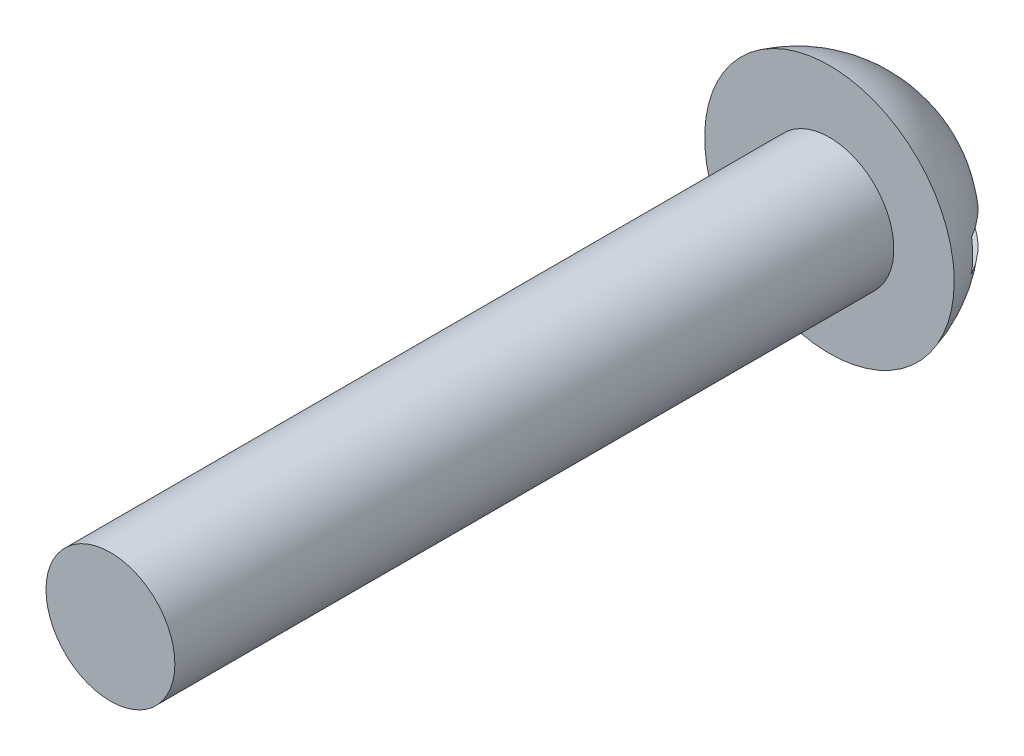
ISO-10303-21;
HEADER;
FILE_DESCRIPTION(('STEP AP214'),'2;1');
FILE_NAME('part.step','',(''),(''),'','','');
FILE_SCHEMA(('AUTOMOTIVE_DESIGN { 1 0 10303 214 1 1 1 1 }'));
ENDSEC;
DATA;
#1=APPLICATION_CONTEXT('core data for automotive mechanical design processes');
#2=APPLICATION_PROTOCOL_DEFINITION('international standard','automotive_design',2000,#1);
#3=PRODUCT_CONTEXT('',#1,'mechanical');
#4=PRODUCT('Part','Part','',(#3));
#5=PRODUCT_RELATED_PRODUCT_CATEGORY('part','',(#4));
#6=PRODUCT_DEFINITION_FORMATION('','',#4);
#7=PRODUCT_DEFINITION_CONTEXT('part definition',#1,'design');
#8=PRODUCT_DEFINITION('design','',#6,#7);
#9=PRODUCT_DEFINITION_SHAPE('','',#8);
#10=(LENGTH_UNIT() NAMED_UNIT(*) SI_UNIT(.MILLI.,.METRE.));
#11=(NAMED_UNIT(*) PLANE_ANGLE_UNIT() SI_UNIT($,.RADIAN.));
#12=(NAMED_UNIT(*) SI_UNIT($,.STERADIAN.) SOLID_ANGLE_UNIT());
#13=UNCERTAINTY_MEASURE_WITH_UNIT(LENGTH_MEASURE(1.E-05),#10,'distance_accuracy_value','');
#14=(GEOMETRIC_REPRESENTATION_CONTEXT(3) GLOBAL_UNCERTAINTY_ASSIGNED_CONTEXT((#13)) GLOBAL_UNIT_ASSIGNED_CONTEXT((#10,
#11,#12)) REPRESENTATION_CONTEXT('',''));
#15=CARTESIAN_POINT('',(0.,0.,0.));
#16=DIRECTION('',(0.,0.,1.));
#17=DIRECTION('',(1.,0.,0.));
#18=AXIS2_PLACEMENT_3D('',#15,#16,#17);
#19=CARTESIAN_POINT('',(0.,15.282157927206,23.5712));
#20=DIRECTION('',(0.,0.,1.));
#21=DIRECTION('',(0.,1.,0.));
#22=AXIS2_PLACEMENT_3D('',#19,#20,#21);
#23=SPHERICAL_SURFACE('',#22,2.8448);
#24=CARTESIAN_POINT('',(0.,15.282157927206,22.86));
#25=DIRECTION('',(0.,0.,1.));
#26=DIRECTION('',(1.,0.,0.));
#27=AXIS2_PLACEMENT_3D('',#24,#25,#26);
#28=CIRCLE('',#27,2.75446575582271);
#29=CARTESIAN_POINT('',(2.75446575582271,15.282157927206,22.86));
#30=VERTEX_POINT('',#29);
#31=EDGE_CURVE('E74',#30,#30,#28,.T.);
#32=ORIENTED_EDGE('',*,*,#31,.F.);
#33=EDGE_LOOP('',(#32));
#34=FACE_BOUND('',#33,.T.);
#35=CARTESIAN_POINT('',(0.,15.282157927206,22.1711125013563));
#36=DIRECTION('',(0.,0.,-1.));
#37=DIRECTION('',(-1.,0.,0.));
#38=AXIS2_PLACEMENT_3D('',#35,#36,#37);
#39=CIRCLE('',#38,2.47641717732324);
#40=CARTESIAN_POINT('',(2.4507530834708,15.637757927206,22.1711125013563));
#41=VERTEX_POINT('',#40);
#42=CARTESIAN_POINT('',(2.4507530834708,14.926557927206,22.1711125013563));
#43=VERTEX_POINT('',#42);
#44=EDGE_CURVE('E67',#41,#43,#39,.T.);
#45=ORIENTED_EDGE('',*,*,#44,.F.);
#46=CARTESIAN_POINT('',(0.,15.637757927206,23.5712));
#47=DIRECTION('',(0.,1.,0.));
#48=DIRECTION('',(0.,0.,1.));
#49=AXIS2_PLACEMENT_3D('',#46,#47,#48);
#50=CIRCLE('',#49,2.82248749864371);
#51=CARTESIAN_POINT('',(-2.4507530834708,15.637757927206,22.1711125013563));
#52=VERTEX_POINT('',#51);
#53=EDGE_CURVE('E80',#41,#52,#50,.T.);
#54=ORIENTED_EDGE('',*,*,#53,.T.);
#55=CARTESIAN_POINT('',(0.,15.282157927206,22.1711125013563));
#56=DIRECTION('',(0.,0.,1.));
#57=DIRECTION('',(1.,0.,0.));
#58=AXIS2_PLACEMENT_3D('',#55,#56,#57);
#59=CIRCLE('',#58,2.47641717732324);
#60=CARTESIAN_POINT('',(-2.4507530834708,14.926557927206,22.1711125013563));
#61=VERTEX_POINT('',#60);
#62=EDGE_CURVE('E42',#52,#61,#59,.T.);
#63=ORIENTED_EDGE('',*,*,#62,.T.);
#64=CARTESIAN_POINT('',(0.,14.926557927206,23.5712));
#65=DIRECTION('',(0.,-1.,0.));
#66=DIRECTION('',(0.,0.,-1.));
#67=AXIS2_PLACEMENT_3D('',#64,#65,#66);
#68=CIRCLE('',#67,2.82248749864371);
#69=EDGE_CURVE('E11',#61,#43,#68,.T.);
#70=ORIENTED_EDGE('',*,*,#69,.T.);
#71=EDGE_LOOP('',(#45,#54,#63,#70));
#72=FACE_BOUND('',#71,.T.);
#73=ADVANCED_FACE('F34',(#34,#72),#23,.T.);
#74=CARTESIAN_POINT('',(0.,18.0366236830287,22.86));
#75=DIRECTION('',(0.,0.,-1.));
#76=DIRECTION('',(-1.,0.,0.));
#77=AXIS2_PLACEMENT_3D('',#74,#75,#76);
#78=PLANE('',#77);
#79=ORIENTED_EDGE('',*,*,#31,.T.);
#80=EDGE_LOOP('',(#79));
#81=FACE_BOUND('',#80,.T.);
#82=CARTESIAN_POINT('',(0.,15.24,22.86));
#83=DIRECTION('',(0.,0.,-1.));
#84=DIRECTION('',(-1.,0.,0.));
#85=AXIS2_PLACEMENT_3D('',#82,#83,#84);
#86=CIRCLE('',#85,1.4224);
#87=CARTESIAN_POINT('',(-1.4224,15.24,22.86));
#88=VERTEX_POINT('',#87);
#89=EDGE_CURVE('E77',#88,#88,#86,.F.);
#90=ORIENTED_EDGE('',*,*,#89,.F.);
#91=EDGE_LOOP('',(#90));
#92=FACE_BOUND('',#91,.T.);
#93=ADVANCED_FACE('F36',(#81,#92),#78,.F.);
#94=CARTESIAN_POINT('',(0.,15.24,38.735));
#95=DIRECTION('',(0.,0.,-1.));
#96=DIRECTION('',(-1.,0.,0.));
#97=AXIS2_PLACEMENT_3D('',#94,#95,#96);
#98=CYLINDRICAL_SURFACE('',#97,1.4224);
#99=CARTESIAN_POINT('',(0.,15.24,38.735));
#100=DIRECTION('',(0.,0.,1.));
#101=DIRECTION('',(1.,0.,0.));
#102=AXIS2_PLACEMENT_3D('',#99,#100,#101);
#103=CIRCLE('',#102,1.4224);
#104=CARTESIAN_POINT('',(1.4224,15.24,38.735));
#105=VERTEX_POINT('',#104);
#106=EDGE_CURVE('E61',#105,#105,#103,.T.);
#107=ORIENTED_EDGE('',*,*,#106,.F.);
#108=EDGE_LOOP('',(#107));
#109=FACE_BOUND('',#108,.T.);
#110=ORIENTED_EDGE('',*,*,#89,.T.);
#111=EDGE_LOOP('',(#110));
#112=FACE_BOUND('',#111,.T.);
#113=ADVANCED_FACE('F95',(#109,#112),#98,.T.);
#114=CARTESIAN_POINT('',(0.,15.24,38.735));
#115=DIRECTION('',(0.,0.,1.));
#116=DIRECTION('',(1.,0.,0.));
#117=AXIS2_PLACEMENT_3D('',#114,#115,#116);
#118=PLANE('',#117);
#119=ORIENTED_EDGE('',*,*,#106,.T.);
#120=EDGE_LOOP('',(#119));
#121=FACE_BOUND('',#120,.T.);
#122=ADVANCED_FACE('F100',(#121),#118,.T.);
#123=CARTESIAN_POINT('',(-2.75446575582271,14.926557927206,22.1711125013563));
#124=DIRECTION('',(0.,-1.,0.));
#125=DIRECTION('',(0.,0.,-1.));
#126=AXIS2_PLACEMENT_3D('',#123,#124,#125);
#127=PLANE('',#126);
#128=DIRECTION('',(1.,0.,0.));
#129=VECTOR('',#128,1.);
#130=CARTESIAN_POINT('',(-2.75446575582271,14.926557927206,22.1711125013563));
#131=LINE('',#130,#129);
#132=EDGE_CURVE('E58',#61,#43,#131,.T.);
#133=ORIENTED_EDGE('',*,*,#132,.T.);
#134=ORIENTED_EDGE('',*,*,#69,.F.);
#135=EDGE_LOOP('',(#133,#134));
#136=FACE_BOUND('',#135,.T.);
#137=ADVANCED_FACE('F59',(#136),#127,.F.);
#138=CARTESIAN_POINT('',(-2.75446575582271,15.637757927206,22.1711125013563));
#139=DIRECTION('',(0.,0.,1.));
#140=DIRECTION('',(1.,0.,0.));
#141=AXIS2_PLACEMENT_3D('',#138,#139,#140);
#142=PLANE('',#141);
#143=DIRECTION('',(1.,0.,0.));
#144=VECTOR('',#143,1.);
#145=CARTESIAN_POINT('',(-2.75446575582271,15.637757927206,22.1711125013563));
#146=LINE('',#145,#144);
#147=EDGE_CURVE('E62',#52,#41,#146,.T.);
#148=ORIENTED_EDGE('',*,*,#147,.T.);
#149=ORIENTED_EDGE('',*,*,#44,.T.);
#150=ORIENTED_EDGE('',*,*,#132,.F.);
#151=ORIENTED_EDGE('',*,*,#62,.F.);
#152=EDGE_LOOP('',(#148,#149,#150,#151));
#153=FACE_BOUND('',#152,.T.);
#154=ADVANCED_FACE('F68',(#153),#142,.F.);
#155=CARTESIAN_POINT('',(-2.75446575582271,15.637757927206,22.1711125013563));
#156=DIRECTION('',(0.,1.,0.));
#157=DIRECTION('',(0.,0.,1.));
#158=AXIS2_PLACEMENT_3D('',#155,#156,#157);
#159=PLANE('',#158);
#160=ORIENTED_EDGE('',*,*,#53,.F.);
#161=ORIENTED_EDGE('',*,*,#147,.F.);
#162=EDGE_LOOP('',(#160,#161));
#163=FACE_BOUND('',#162,.T.);
#164=ADVANCED_FACE('F82',(#163),#159,.F.);
#165=CLOSED_SHELL('',(#73,#93,#113,#122,#137,#154,#164));
#166=MANIFOLD_SOLID_BREP('B2',#165);
#167=ADVANCED_BREP_SHAPE_REPRESENTATION('',(#18,#166),#14);
#168=SHAPE_DEFINITION_REPRESENTATION(#9,#167);
ENDSEC;
END-ISO-10303-21;
